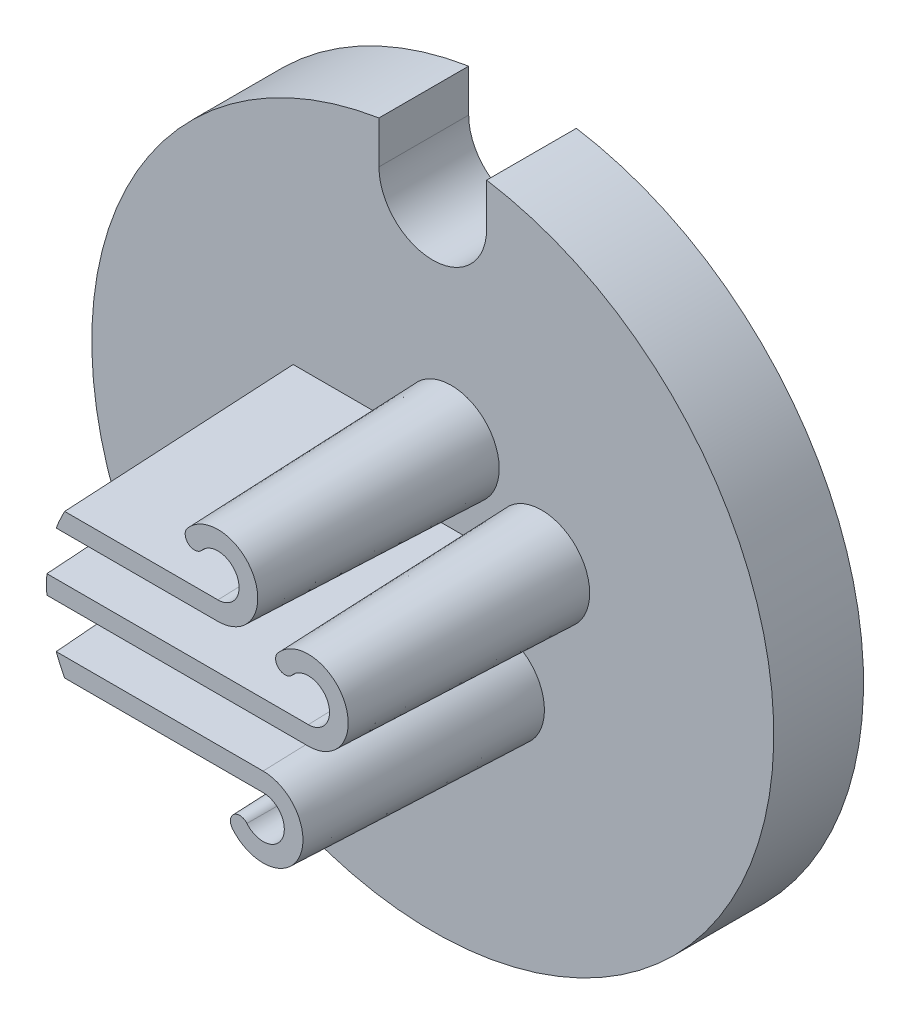
ISO-10303-21;
HEADER;
FILE_DESCRIPTION(('STEP AP214'),'2;1');
FILE_NAME('part.step','',(''),(''),'','','');
FILE_SCHEMA(('AUTOMOTIVE_DESIGN { 1 0 10303 214 1 1 1 1 }'));
ENDSEC;
DATA;
#1=APPLICATION_CONTEXT('core data for automotive mechanical design processes');
#2=APPLICATION_PROTOCOL_DEFINITION('international standard','automotive_design',2000,#1);
#3=PRODUCT_CONTEXT('',#1,'mechanical');
#4=PRODUCT('Part','Part','',(#3));
#5=PRODUCT_RELATED_PRODUCT_CATEGORY('part','',(#4));
#6=PRODUCT_DEFINITION_FORMATION('','',#4);
#7=PRODUCT_DEFINITION_CONTEXT('part definition',#1,'design');
#8=PRODUCT_DEFINITION('design','',#6,#7);
#9=PRODUCT_DEFINITION_SHAPE('','',#8);
#10=(LENGTH_UNIT() NAMED_UNIT(*) SI_UNIT(.MILLI.,.METRE.));
#11=(NAMED_UNIT(*) PLANE_ANGLE_UNIT() SI_UNIT($,.RADIAN.));
#12=(NAMED_UNIT(*) SI_UNIT($,.STERADIAN.) SOLID_ANGLE_UNIT());
#13=UNCERTAINTY_MEASURE_WITH_UNIT(LENGTH_MEASURE(1.E-05),#10,'distance_accuracy_value','');
#14=(GEOMETRIC_REPRESENTATION_CONTEXT(3) GLOBAL_UNCERTAINTY_ASSIGNED_CONTEXT((#13)) GLOBAL_UNIT_ASSIGNED_CONTEXT((#10,
#11,#12)) REPRESENTATION_CONTEXT('',''));
#15=CARTESIAN_POINT('',(0.,0.,0.));
#16=DIRECTION('',(0.,0.,1.));
#17=DIRECTION('',(1.,0.,0.));
#18=AXIS2_PLACEMENT_3D('',#15,#16,#17);
#19=CARTESIAN_POINT('',(2.38201240094966,1.39636946820992,2.50000000005457));
#20=DIRECTION('',(0.,0.,-1.));
#21=DIRECTION('',(-1.,0.,0.));
#22=AXIS2_PLACEMENT_3D('',#19,#20,#21);
#23=CONICAL_SURFACE('',#22,0.486985001693798,0.0349065850400188);
#24=CARTESIAN_POINT('',(2.38201240094966,1.39636946820992,2.49999999999773));
#25=DIRECTION('',(0.,0.,1.));
#26=DIRECTION('',(-0.766044443144308,0.642787609656352,0.));
#27=AXIS2_PLACEMENT_3D('',#24,#25,#26);
#28=CIRCLE('',#27,0.486985001695784);
#29=CARTESIAN_POINT('',(2.00896024650558,1.70939739339035,2.50000000001));
#30=VERTEX_POINT('',#29);
#31=CARTESIAN_POINT('',(2.75506455539278,1.08334154302959,2.4999999999759));
#32=VERTEX_POINT('',#31);
#33=EDGE_CURVE('E126',#30,#32,#28,.T.);
#34=ORIENTED_EDGE('',*,*,#33,.T.);
#35=DIRECTION('',(0.0267345655174141,-0.0224329640636936,-0.999390827019096));
#36=VECTOR('',#35,1.);
#37=CARTESIAN_POINT('',(-13345.857906575,11201.8995615213,499000.));
#38=LINE('',#37,#36);
#39=CARTESIAN_POINT('',(2.58118395616668,1.22924468969873,8.99999999997462));
#40=VERTEX_POINT('',#39);
#41=EDGE_CURVE('E129',#32,#40,#38,.F.);
#42=ORIENTED_EDGE('',*,*,#41,.T.);
#43=CARTESIAN_POINT('',(2.18284084573267,1.56349424672119,9.));
#44=CARTESIAN_POINT('',(2.11381867301379,1.48123682440876,9.));
#45=CARTESIAN_POINT('',(2.12300177944663,1.37370897508613,9.));
#46=CARTESIAN_POINT('',(2.12753896614898,1.32058164484691,9.));
#47=CARTESIAN_POINT('',(2.15330774130164,1.27269983307144,9.));
#48=CARTESIAN_POINT('',(2.17656184434811,1.22949061654943,9.));
#49=CARTESIAN_POINT('',(2.21488762243839,1.19719791299292,9.));
#50=CARTESIAN_POINT('',(2.25241304942153,1.16557957281093,9.));
#51=CARTESIAN_POINT('',(2.29993573284282,1.14966433945805,9.));
#52=CARTESIAN_POINT('',(2.35049552778685,1.13273198469864,9.));
#53=CARTESIAN_POINT('',(2.40467289407345,1.13735884670689,9.));
#54=CARTESIAN_POINT('',(2.45780022431265,1.14189603340923,9.));
#55=CARTESIAN_POINT('',(2.50568203608814,1.1676648085619,9.));
#56=CARTESIAN_POINT('',(2.54913478459891,1.1910499743403,9.));
#57=CARTESIAN_POINT('',(2.58118395616666,1.22924468969865,9.));
#58=B_SPLINE_CURVE_WITH_KNOTS('',2,(#43,#44,#45,#46,#47,#48,#49,#50,#51,#52,#53,#54,#55,#56,
#57),.UNSPECIFIED.,.F.,.F.,(3,2,2,2,2,2,2,3),(0.,0.25,0.375,0.5,0.625,0.75,0.875,1.),.UNSPECIFIED.);
#59=CARTESIAN_POINT('',(2.18284084573224,1.56349424672145,9.00000000000873));
#60=VERTEX_POINT('',#59);
#61=EDGE_CURVE('E137',#60,#40,#58,.T.);
#62=ORIENTED_EDGE('',*,*,#61,.F.);
#63=DIRECTION('',(0.0267345655174141,-0.0224329640636937,0.999390827019096));
#64=VECTOR('',#63,1.);
#65=CARTESIAN_POINT('',(-13346.737765191,11202.6378505614,-499000.));
#66=LINE('',#65,#64);
#67=EDGE_CURVE('E131',#30,#60,#66,.T.);
#68=ORIENTED_EDGE('',*,*,#67,.F.);
#69=EDGE_LOOP('',(#34,#42,#62,#68));
#70=FACE_BOUND('',#69,.T.);
#71=ADVANCED_FACE('F16',(#70),#23,.T.);
#72=CARTESIAN_POINT('',(0.,-0.059584240176571,9.));
#73=DIRECTION('',(0.,0.,1.));
#74=DIRECTION('',(1.,0.,0.));
#75=AXIS2_PLACEMENT_3D('',#72,#73,#74);
#76=PLANE('',#75);
#77=CARTESIAN_POINT('',(2.58118395616666,1.22924468969865,9.));
#78=CARTESIAN_POINT('',(2.67697081632274,1.34339902442139,9.));
#79=CARTESIAN_POINT('',(2.81596355358364,1.39857084350102,9.));
#80=CARTESIAN_POINT('',(2.96063041068655,1.45599494942331,9.));
#81=CARTESIAN_POINT('',(3.11578763152388,1.43418409017397,9.));
#82=CARTESIAN_POINT('',(3.25945756823654,1.41398802871391,9.));
#83=CARTESIAN_POINT('',(3.37808877295752,1.32866205766387,9.));
#84=CARTESIAN_POINT('',(3.50252083469823,1.23916379687526,9.));
#85=CARTESIAN_POINT('',(3.56787177196772,1.09934477443672,9.));
#86=CARTESIAN_POINT('',(3.63277254879005,0.960488875042656,9.));
#87=CARTESIAN_POINT('',(3.62154884221274,0.806560254303054,9.));
#88=CARTESIAN_POINT('',(3.61099805575308,0.661860462281041,9.));
#89=CARTESIAN_POINT('',(3.53377948513329,0.53779766743443,9.));
#90=CARTESIAN_POINT('',(3.45153285883404,0.405656574385303,9.));
#91=CARTESIAN_POINT('',(3.31377495303989,0.33101085230914,9.));
#92=CARTESIAN_POINT('',(3.1827251616964,0.26,9.));
#93=CARTESIAN_POINT('',(3.03315017762062,0.26,9.));
#94=B_SPLINE_CURVE_WITH_KNOTS('',2,(#77,#78,#79,#80,#81,#82,#83,#84,#85,#86,#87,#88,#89,#90,#91,
#92,#93),.UNSPECIFIED.,.F.,.F.,(3,2,2,2,2,2,2,2,3),(0.,0.125,0.25,0.375,0.5,0.625,0.75,0.875,
1.),.UNSPECIFIED.);
#95=CARTESIAN_POINT('',(3.03315017762062,0.259999999999376,9.00000000000364));
#96=VERTEX_POINT('',#95);
#97=EDGE_CURVE('E148',#40,#96,#94,.T.);
#98=ORIENTED_EDGE('',*,*,#97,.T.);
#99=DIRECTION('',(1.,0.,0.));
#100=VECTOR('',#99,1.);
#101=CARTESIAN_POINT('',(0.,0.26,9.));
#102=LINE('',#101,#100);
#103=CARTESIAN_POINT('',(-4.25205832509357,0.259999999999983,9.00000000000291));
#104=VERTEX_POINT('',#103);
#105=EDGE_CURVE('E715',#104,#96,#102,.T.);
#106=ORIENTED_EDGE('',*,*,#105,.F.);
#107=CARTESIAN_POINT('',(-2.22044604925031E-13,0.,9.00000000001455));
#108=DIRECTION('',(0.,0.,-1.));
#109=DIRECTION('',(-0.998135757064285,-0.0610328638497867,0.));
#110=AXIS2_PLACEMENT_3D('',#107,#108,#109);
#111=CIRCLE('',#110,4.25999999999882);
#112=CARTESIAN_POINT('',(-4.25205832509357,-0.259999999999984,9.00000000000291));
#113=VERTEX_POINT('',#112);
#114=EDGE_CURVE('E488',#113,#104,#111,.T.);
#115=ORIENTED_EDGE('',*,*,#114,.F.);
#116=DIRECTION('',(1.,0.,0.));
#117=VECTOR('',#116,1.);
#118=CARTESIAN_POINT('',(0.,-0.26,9.));
#119=LINE('',#118,#117);
#120=CARTESIAN_POINT('',(3.03315017762062,-0.260000000000431,9.00000000000364));
#121=VERTEX_POINT('',#120);
#122=EDGE_CURVE('E537',#121,#113,#119,.F.);
#123=ORIENTED_EDGE('',*,*,#122,.F.);
#124=CARTESIAN_POINT('',(3.03315017762062,0.85,9.00000000001455));
#125=DIRECTION('',(0.,0.,-1.));
#126=DIRECTION('',(-0.766044443142215,0.642787609658847,0.));
#127=AXIS2_PLACEMENT_3D('',#124,#125,#126);
#128=CIRCLE('',#127,1.11000000000173);
#129=EDGE_CURVE('E534',#60,#121,#128,.T.);
#130=ORIENTED_EDGE('',*,*,#129,.F.);
#131=ORIENTED_EDGE('',*,*,#61,.T.);
#132=EDGE_LOOP('',(#98,#106,#115,#123,#130,#131));
#133=FACE_BOUND('',#132,.T.);
#134=ADVANCED_FACE('F508',(#133),#76,.T.);
#135=CARTESIAN_POINT('',(3.03315017762062,0.85,8.99999999984402));
#136=DIRECTION('',(0.,0.,1.));
#137=DIRECTION('',(1.,0.,0.));
#138=AXIS2_PLACEMENT_3D('',#135,#136,#137);
#139=CONICAL_SURFACE('',#138,0.589999999996543,0.0349065850400188);
#140=ORIENTED_EDGE('',*,*,#41,.F.);
#141=CARTESIAN_POINT('',(3.03315017762062,0.48698500169636,2.5));
#142=CARTESIAN_POINT('',(3.12473025880445,0.48698500169636,2.5));
#143=CARTESIAN_POINT('',(3.2058128935067,0.530676534629483,2.5));
#144=CARTESIAN_POINT('',(3.28994350684749,0.57601047668701,2.5));
#145=CARTESIAN_POINT('',(3.34117720680276,0.657908255547995,2.5));
#146=CARTESIAN_POINT('',(3.38841286629723,0.733415111367655,2.5));
#147=CARTESIAN_POINT('',(3.39517990682193,0.823272408117817,2.5));
#148=CARTESIAN_POINT('',(3.40224665970291,0.917109486286406,2.5));
#149=CARTESIAN_POINT('',(3.36215349739152,1.00341676757486,2.5));
#150=CARTESIAN_POINT('',(3.32250823367315,1.08875987174115,2.5));
#151=CARTESIAN_POINT('',(3.24538387863941,1.14451102720486,2.5));
#152=CARTESIAN_POINT('',(3.17320224197974,1.19668922234538,2.5));
#153=CARTESIAN_POINT('',(3.08399532200792,1.2094365872941,2.5));
#154=CARTESIAN_POINT('',(2.98938975383603,1.22295540067818,2.5));
#155=CARTESIAN_POINT('',(2.89951966583019,1.18752448105585,2.5));
#156=CARTESIAN_POINT('',(2.81428918462994,1.15392270769849,2.5));
#157=CARTESIAN_POINT('',(2.7550645553928,1.08334154302987,2.5));
#158=B_SPLINE_CURVE_WITH_KNOTS('',2,(#141,#142,#143,#144,#145,#146,#147,#148,#149,#150,#151,
#152,#153,#154,#155,#156,#157),.UNSPECIFIED.,.F.,.F.,(3,2,2,2,2,2,2,2,3),(0.,0.125,0.25,0.375,
0.5,0.625,0.75,0.875,1.),.UNSPECIFIED.);
#159=CARTESIAN_POINT('',(3.03315017762062,0.486985001696098,2.49999999999943));
#160=VERTEX_POINT('',#159);
#161=EDGE_CURVE('E144',#160,#32,#158,.T.);
#162=ORIENTED_EDGE('',*,*,#161,.F.);
#163=DIRECTION('',(0.,-0.0348994967025009,0.999390827019096));
#164=VECTOR('',#163,1.);
#165=CARTESIAN_POINT('',(3.03315017762062,0.26,9.));
#166=LINE('',#165,#164);
#167=EDGE_CURVE('E1127',#96,#160,#166,.F.);
#168=ORIENTED_EDGE('',*,*,#167,.F.);
#169=ORIENTED_EDGE('',*,*,#97,.F.);
#170=EDGE_LOOP('',(#140,#162,#168,#169));
#171=FACE_BOUND('',#170,.T.);
#172=ADVANCED_FACE('F142',(#171),#139,.F.);
#173=CARTESIAN_POINT('',(-2.22044604925031E-13,0.,2.50000000005457));
#174=DIRECTION('',(0.,0.,-1.));
#175=DIRECTION('',(-1.,0.,0.));
#176=AXIS2_PLACEMENT_3D('',#173,#174,#175);
#177=CONICAL_SURFACE('',#176,4.48698500169464,0.0349065850400188);
#178=CARTESIAN_POINT('',(-2.22044604925031E-13,0.,2.49999999999773));
#179=DIRECTION('',(0.,0.,1.));
#180=DIRECTION('',(-0.994092869634086,0.108532790172682,0.));
#181=AXIS2_PLACEMENT_3D('',#178,#179,#180);
#182=CIRCLE('',#181,4.48698500169663);
#183=CARTESIAN_POINT('',(-4.46047979634215,0.486985001696865,2.49999999999953));
#184=VERTEX_POINT('',#183);
#185=CARTESIAN_POINT('',(-4.46047979634213,-0.486985001696867,2.49999999999953));
#186=VERTEX_POINT('',#185);
#187=EDGE_CURVE('E476',#184,#186,#182,.T.);
#188=ORIENTED_EDGE('',*,*,#187,.T.);
#189=CARTESIAN_POINT('',(-4.25205832509384,-0.26,9.));
#190=CARTESIAN_POINT('',(-4.35626906070877,-0.370777531483909,5.82774655037062));
#191=CARTESIAN_POINT('',(-4.46047979634227,-0.486985001696361,2.49999999999997));
#192=B_SPLINE_CURVE_WITH_KNOTS('',2,(#189,#190,#191),.UNSPECIFIED.,.F.,.F.,(3,3),(0.,1.),.UNSPECIFIED.);
#193=EDGE_CURVE('E573',#113,#186,#192,.T.);
#194=ORIENTED_EDGE('',*,*,#193,.F.);
#195=ORIENTED_EDGE('',*,*,#114,.T.);
#196=CARTESIAN_POINT('',(-4.46047979634229,0.486985001696361,2.49999999999997));
#197=CARTESIAN_POINT('',(-4.3562690607086,0.370777531483712,5.82774655037627));
#198=CARTESIAN_POINT('',(-4.25205832509384,0.26,9.));
#199=B_SPLINE_CURVE_WITH_KNOTS('',2,(#196,#197,#198),.UNSPECIFIED.,.F.,.F.,(3,3),(0.,1.),.UNSPECIFIED.);
#200=EDGE_CURVE('E711',#184,#104,#199,.T.);
#201=ORIENTED_EDGE('',*,*,#200,.F.);
#202=EDGE_LOOP('',(#188,#194,#195,#201));
#203=FACE_BOUND('',#202,.T.);
#204=ADVANCED_FACE('F423',(#203),#177,.T.);
#205=CARTESIAN_POINT('',(0.51315017762061,2.59999999999988,8.99999999978718));
#206=DIRECTION('',(0.,0.,1.));
#207=DIRECTION('',(1.,0.,0.));
#208=AXIS2_PLACEMENT_3D('',#205,#206,#207);
#209=CONICAL_SURFACE('',#208,0.589999999992478,0.034906585039923);
#210=CARTESIAN_POINT('',(0.235088754926668,2.83332124794786,2.50000082712633));
#211=CARTESIAN_POINT('',(0.2278422268159,2.83940168960281,2.7708341060612));
#212=CARTESIAN_POINT('',(0.220595705951798,2.84548213989399,3.04166738499609));
#213=CARTESIAN_POINT('',(0.206102678716961,2.85764305774878,3.58333394286584));
#214=CARTESIAN_POINT('',(0.198856172346225,2.8637235253124,3.85416722180072));
#215=CARTESIAN_POINT('',(0.18436317409815,2.87588447771203,4.39583377967048));
#216=CARTESIAN_POINT('',(0.177116682220811,2.88196496254805,4.66666705860536));
#217=CARTESIAN_POINT('',(0.162623712959559,2.89412594949246,5.20833361647512));
#218=CARTESIAN_POINT('',(0.155377235575647,2.90020645160086,5.47916689541));
#219=CARTESIAN_POINT('',(0.140884295301281,2.91236747309002,6.02083345327976));
#220=CARTESIAN_POINT('',(0.133637832410828,2.91844799247077,6.29166673221464));
#221=CARTESIAN_POINT('',(0.119144921123409,2.93060904850461,6.8333332900844));
#222=CARTESIAN_POINT('',(0.111898472726444,2.93668958515769,7.10416656901928));
#223=CARTESIAN_POINT('',(0.097405590426035,2.94885067573616,7.64583312688904));
#224=CARTESIAN_POINT('',(0.0901591565225902,2.95493122966155,7.91666640582392));
#225=CARTESIAN_POINT('',(0.0756663032092515,2.96709235478459,8.45833296369368));
#226=CARTESIAN_POINT('',(0.0684198837993576,2.97317292598226,8.72916624262856));
#227=CARTESIAN_POINT('',(0.0611734716362545,2.97925350581605,8.99999952156345));
#228=B_SPLINE_CURVE_WITH_KNOTS('',3,(#210,#211,#212,#213,#214,#215,#216,#217,#218,#219,#220,
#221,#222,#223,#224,#225,#226,#227),.UNSPECIFIED.,.F.,.F.,(4,2,2,2,2,2,2,2,4),(0.,
0.812995289205885,1.62599057841175,2.43898586761759,3.25198115682341,4.06497644602921,
4.877971735235,5.69096702444077,6.50396231364652),.UNSPECIFIED.);
#229=CARTESIAN_POINT('',(0.235076659767047,2.83333139714779,2.50000047160848));
#230=VERTEX_POINT('',#229);
#231=CARTESIAN_POINT('',(0.0611787162847192,2.97924910487298,8.99999976341618));
#232=VERTEX_POINT('',#231);
#233=EDGE_CURVE('E443',#230,#232,#228,.T.);
#234=ORIENTED_EDGE('',*,*,#233,.F.);
#235=CARTESIAN_POINT('',(0.513150177620611,2.23698500169636,2.5));
#236=CARTESIAN_POINT('',(0.604730258267178,2.23698500169636,2.5));
#237=CARTESIAN_POINT('',(0.68581289261778,2.28067653414877,2.5));
#238=CARTESIAN_POINT('',(0.769943505542546,2.32601047567994,2.5));
#239=CARTESIAN_POINT('',(0.821177205659085,2.40790825371396,2.5));
#240=CARTESIAN_POINT('',(0.868412865339471,2.48341510883072,2.5));
#241=CARTESIAN_POINT('',(0.875179906593846,2.57327240502845,2.5));
#242=CARTESIAN_POINT('',(0.882246660231517,2.66710948254973,2.5));
#243=CARTESIAN_POINT('',(0.842153499166292,2.75341676376871,2.5));
#244=CARTESIAN_POINT('',(0.802508236683245,2.83875986785966,2.5));
#245=CARTESIAN_POINT('',(0.725383882940317,2.89451102410536,2.5));
#246=CARTESIAN_POINT('',(0.653201745408832,2.94668958291806,2.5));
#247=CARTESIAN_POINT('',(0.563996151004999,2.95943589599156,2.5));
#248=CARTESIAN_POINT('',(0.469391899828661,2.97295360653019,2.5));
#249=CARTESIAN_POINT('',(0.379524930952516,2.93752007157741,2.5));
#250=CARTESIAN_POINT('',(0.294297407812164,2.9039158178911,2.5));
#251=CARTESIAN_POINT('',(0.235076661602182,2.83333139567753,2.5));
#252=B_SPLINE_CURVE_WITH_KNOTS('',2,(#235,#236,#237,#238,#239,#240,#241,#242,#243,#244,#245,
#246,#247,#248,#249,#250,#251),.UNSPECIFIED.,.F.,.F.,(3,2,2,2,2,2,2,2,3),(0.,0.125,0.25,0.375,
0.5,0.625,0.75,0.875,1.),.UNSPECIFIED.);
#253=CARTESIAN_POINT('',(0.513150177620611,2.23698500169643,2.49999999999943));
#254=VERTEX_POINT('',#253);
#255=EDGE_CURVE('E462',#254,#230,#252,.T.);
#256=ORIENTED_EDGE('',*,*,#255,.F.);
#257=DIRECTION('',(0.,-0.0348994967025009,0.999390827019096));
#258=VECTOR('',#257,1.);
#259=CARTESIAN_POINT('',(0.513150177620611,2.01,9.));
#260=LINE('',#259,#258);
#261=CARTESIAN_POINT('',(0.513150177620611,2.01000000000036,8.99999999998943));
#262=VERTEX_POINT('',#261);
#263=EDGE_CURVE('E703',#262,#254,#260,.F.);
#264=ORIENTED_EDGE('',*,*,#263,.F.);
#265=CARTESIAN_POINT('',(0.0611787183787752,2.97924910309323,9.));
#266=CARTESIAN_POINT('',(0.15696725667547,3.09340202851268,9.));
#267=CARTESIAN_POINT('',(0.295961285148526,3.14857276115783,9.));
#268=CARTESIAN_POINT('',(0.440629486086433,3.20599573625885,9.));
#269=CARTESIAN_POINT('',(0.595787285101314,3.18418438807556,9.));
#270=CARTESIAN_POINT('',(0.739457794564514,3.16398786862588,9.));
#271=CARTESIAN_POINT('',(0.858088780163022,3.07866205247123,9.));
#272=CARTESIAN_POINT('',(0.982520839755821,2.98916379038571,9.));
#273=CARTESIAN_POINT('',(1.04787177494108,2.84934476806019,9.));
#274=CARTESIAN_POINT('',(1.11277254968997,2.71048886878599,9.));
#275=CARTESIAN_POINT('',(1.10154884183063,2.55656024912738,9.));
#276=CARTESIAN_POINT('',(1.09099805415907,2.41186045802914,9.));
#277=CARTESIAN_POINT('',(1.01377948321724,2.28779766436187,9.));
#278=CARTESIAN_POINT('',(0.931532856652774,2.15565657269387,9.));
#279=CARTESIAN_POINT('',(0.793774951550655,2.08101085150383,9.));
#280=CARTESIAN_POINT('',(0.662725160796,2.01,9.));
#281=CARTESIAN_POINT('',(0.513150177620611,2.01,9.));
#282=B_SPLINE_CURVE_WITH_KNOTS('',2,(#265,#266,#267,#268,#269,#270,#271,#272,#273,#274,#275,
#276,#277,#278,#279,#280,#281),.UNSPECIFIED.,.F.,.F.,(3,2,2,2,2,2,2,2,3),(0.,0.125,0.25,0.375,
0.5,0.625,0.75,0.875,1.),.UNSPECIFIED.);
#283=EDGE_CURVE('E406',#232,#262,#282,.T.);
#284=ORIENTED_EDGE('',*,*,#283,.F.);
#285=EDGE_LOOP('',(#234,#256,#264,#284));
#286=FACE_BOUND('',#285,.T.);
#287=ADVANCED_FACE('F413',(#286),#209,.F.);
#288=CARTESIAN_POINT('',(-0.137984169460023,3.14637355929855,2.50000082735369));
#289=DIRECTION('',(0.,0.,-1.));
#290=DIRECTION('',(-1.,0.,0.));
#291=AXIS2_PLACEMENT_3D('',#288,#289,#290);
#292=CONICAL_SURFACE('',#291,0.48701658754575,0.0349135499951622);
#293=CARTESIAN_POINT('',(-0.137984169460023,3.14637355929855,2.50000135298478));
#294=DIRECTION('',(0.,0.,1.));
#295=DIRECTION('',(-0.766045947566524,0.64278581675151,0.));
#296=AXIS2_PLACEMENT_3D('',#293,#294,#295);
#297=CIRCLE('',#296,0.487016569186642);
#298=CARTESIAN_POINT('',(-0.511049152580732,3.45941076101538,2.5000007280887));
#299=VERTEX_POINT('',#298);
#300=EDGE_CURVE('E81',#299,#230,#297,.T.);
#301=ORIENTED_EDGE('',*,*,#300,.T.);
#302=ORIENTED_EDGE('',*,*,#233,.T.);
#303=CARTESIAN_POINT('',(-0.337153914314522,3.31348983976598,9.));
#304=CARTESIAN_POINT('',(-0.406167578092475,3.23123472401727,9.));
#305=CARTESIAN_POINT('',(-0.396982449875354,3.12371288055808,9.));
#306=CARTESIAN_POINT('',(-0.392444268310145,3.07058856521817,9.));
#307=CARTESIAN_POINT('',(-0.366676588604586,3.02270970959904,9.));
#308=CARTESIAN_POINT('',(-0.343423455746508,2.97950312664217,9.));
#309=CARTESIAN_POINT('',(-0.305100136014632,2.94721248879156,9.));
#310=CARTESIAN_POINT('',(-0.267577178375805,2.91559622369042,9.));
#311=CARTESIAN_POINT('',(-0.220057244727367,2.89968148272082,9.));
#312=CARTESIAN_POINT('',(-0.169500567008274,2.88274971601982,9.));
#313=CARTESIAN_POINT('',(-0.115325979848481,2.88737506059618,9.));
#314=CARTESIAN_POINT('',(-0.0622014516497128,2.89191075272155,9.));
#315=CARTESIAN_POINT('',(-0.0143213883228831,2.91767618866848,9.));
#316=CARTESIAN_POINT('',(0.0291298261696109,2.941058352476,9.));
#317=CARTESIAN_POINT('',(0.0611787183787752,2.97924910309323,9.));
#318=B_SPLINE_CURVE_WITH_KNOTS('',2,(#303,#304,#305,#306,#307,#308,#309,#310,#311,#312,#313,
#314,#315,#316,#317),.UNSPECIFIED.,.F.,.F.,(3,2,2,2,2,2,2,3),(0.,0.25,0.375,0.5,0.625,0.75,
0.875,1.),.UNSPECIFIED.);
#319=CARTESIAN_POINT('',(-0.33715391213318,3.31348983809459,8.99999976340223));
#320=VERTEX_POINT('',#319);
#321=EDGE_CURVE('E753',#320,#232,#318,.T.);
#322=ORIENTED_EDGE('',*,*,#321,.F.);
#323=CARTESIAN_POINT('',(-0.511037047996394,3.45940060408184,2.50000025010879));
#324=CARTESIAN_POINT('',(-0.503792155099076,3.45332114947577,2.77083357301679));
#325=CARTESIAN_POINT('',(-0.496547259810034,3.44724169771999,3.04166689592479));
#326=CARTESIAN_POINT('',(-0.482057464448504,3.43508279990896,3.5833335417408));
#327=CARTESIAN_POINT('',(-0.474812564376016,3.42900335385373,3.8541668646488));
#328=CARTESIAN_POINT('',(-0.460322759447598,3.41684446744381,4.39583351046481));
#329=CARTESIAN_POINT('',(-0.453077854591667,3.41076502708913,4.66666683337281));
#330=CARTESIAN_POINT('',(-0.438588040096368,3.39860615208033,5.20833347918882));
#331=CARTESIAN_POINT('',(-0.431343130456998,3.39252671742621,5.47916680209682));
#332=CARTESIAN_POINT('',(-0.416853306394824,3.38036785381852,6.02083344791283));
#333=CARTESIAN_POINT('',(-0.40960839197202,3.37428842486496,6.29166677082083));
#334=CARTESIAN_POINT('',(-0.395118558342978,3.36212957265839,6.83333341663684));
#335=CARTESIAN_POINT('',(-0.387873639136741,3.35605014940539,7.10416673954484));
#336=CARTESIAN_POINT('',(-0.373383795940838,3.34389130859996,7.64583338536085));
#337=CARTESIAN_POINT('',(-0.366138871951172,3.33781189104753,7.91666670826885));
#338=CARTESIAN_POINT('',(-0.351649019188415,3.32565306164322,8.45833335408486));
#339=CARTESIAN_POINT('',(-0.344404090415324,3.31957364979136,8.72916667699286));
#340=CARTESIAN_POINT('',(-0.337159159250521,3.31349424078978,8.99999999990087));
#341=B_SPLINE_CURVE_WITH_KNOTS('',3,(#323,#324,#325,#326,#327,#328,#329,#330,#331,#332,#333,
#334,#335,#336,#337,#338,#339,#340),.UNSPECIFIED.,.F.,.F.,(4,2,2,2,2,2,2,2,4),(0.,
0.812995223447911,1.62599044689581,2.43898567034371,3.2519808937916,4.06497611723948,
4.87797134068736,5.69096656413523,6.5039617875831),.UNSPECIFIED.);
#342=EDGE_CURVE('E774',#299,#320,#341,.T.);
#343=ORIENTED_EDGE('',*,*,#342,.F.);
#344=EDGE_LOOP('',(#301,#302,#322,#343));
#345=FACE_BOUND('',#344,.T.);
#346=ADVANCED_FACE('F422',(#345),#292,.T.);
#347=CARTESIAN_POINT('',(0.,-0.059584240176571,9.));
#348=DIRECTION('',(0.,0.,1.));
#349=DIRECTION('',(1.,0.,0.));
#350=AXIS2_PLACEMENT_3D('',#347,#348,#349);
#351=PLANE('',#350);
#352=ORIENTED_EDGE('',*,*,#321,.T.);
#353=ORIENTED_EDGE('',*,*,#283,.T.);
#354=DIRECTION('',(1.,0.,0.));
#355=VECTOR('',#354,1.);
#356=CARTESIAN_POINT('',(0.,2.01,9.));
#357=LINE('',#356,#355);
#358=CARTESIAN_POINT('',(-3.75599520766439,2.00999999999989,9.00000000000291));
#359=VERTEX_POINT('',#358);
#360=EDGE_CURVE('E706',#359,#262,#357,.T.);
#361=ORIENTED_EDGE('',*,*,#360,.F.);
#362=CARTESIAN_POINT('',(-2.62376925741492E-13,1.15250690935209E-13,9.00000000001455));
#363=DIRECTION('',(0.,0.,-1.));
#364=DIRECTION('',(-0.93683737337124,0.349765258215958,0.));
#365=AXIS2_PLACEMENT_3D('',#362,#363,#364);
#366=CIRCLE('',#365,4.25999999999886);
#367=CARTESIAN_POINT('',(-3.99092721056125,1.48999999999992,9.00000000000291));
#368=VERTEX_POINT('',#367);
#369=EDGE_CURVE('E390',#368,#359,#366,.T.);
#370=ORIENTED_EDGE('',*,*,#369,.F.);
#371=DIRECTION('',(1.,0.,0.));
#372=VECTOR('',#371,1.);
#373=CARTESIAN_POINT('',(0.,1.49,9.));
#374=LINE('',#373,#372);
#375=CARTESIAN_POINT('',(0.51315017762061,1.48999999999875,8.99999999997521));
#376=VERTEX_POINT('',#375);
#377=EDGE_CURVE('E696',#376,#368,#374,.F.);
#378=ORIENTED_EDGE('',*,*,#377,.F.);
#379=CARTESIAN_POINT('',(0.513150177620611,2.59999999999988,8.99999999990087));
#380=DIRECTION('',(0.,0.,-1.));
#381=DIRECTION('',(-0.766044447628362,0.642787604312465,0.));
#382=AXIS2_PLACEMENT_3D('',#379,#380,#381);
#383=CIRCLE('',#382,1.11000000000477);
#384=EDGE_CURVE('E776',#320,#376,#383,.T.);
#385=ORIENTED_EDGE('',*,*,#384,.F.);
#386=EDGE_LOOP('',(#352,#353,#361,#370,#378,#385));
#387=FACE_BOUND('',#386,.T.);
#388=ADVANCED_FACE('F364',(#387),#351,.T.);
#389=CARTESIAN_POINT('',(-2.62376925741492E-13,1.15250690935209E-13,2.50000000005457));
#390=DIRECTION('',(0.,0.,-1.));
#391=DIRECTION('',(-1.,0.,0.));
#392=AXIS2_PLACEMENT_3D('',#389,#390,#391);
#393=CONICAL_SURFACE('',#392,4.48698500169468,0.0349065850400188);
#394=CARTESIAN_POINT('',(-2.62376925741492E-13,1.15250690935209E-13,2.49999999999773));
#395=DIRECTION('',(0.,0.,1.));
#396=DIRECTION('',(-0.866861120446538,0.498549694472049,0.));
#397=AXIS2_PLACEMENT_3D('',#394,#395,#396);
#398=CIRCLE('',#397,4.48698500169667);
#399=CARTESIAN_POINT('',(-3.88959284599752,2.23698500169647,2.49999999999955));
#400=VERTEX_POINT('',#399);
#401=CARTESIAN_POINT('',(-4.30555774778576,1.26301499830295,2.49999999999953));
#402=VERTEX_POINT('',#401);
#403=EDGE_CURVE('E240',#400,#402,#398,.T.);
#404=ORIENTED_EDGE('',*,*,#403,.T.);
#405=CARTESIAN_POINT('',(-3.99092721056148,1.49,9.));
#406=CARTESIAN_POINT('',(-4.14824247916245,1.38081151546149,5.87325090117757));
#407=CARTESIAN_POINT('',(-4.305557747786,1.26301499830364,2.49999999999996));
#408=B_SPLINE_CURVE_WITH_KNOTS('',2,(#405,#406,#407),.UNSPECIFIED.,.F.,.F.,(3,3),(0.,1.),.UNSPECIFIED.);
#409=EDGE_CURVE('E347',#368,#402,#408,.T.);
#410=ORIENTED_EDGE('',*,*,#409,.F.);
#411=ORIENTED_EDGE('',*,*,#369,.T.);
#412=CARTESIAN_POINT('',(-3.88959284599733,2.23698500169636,2.5));
#413=DIRECTION('',(0.0205366301291652,-0.0348921364395594,0.999180056665274));
#414=VECTOR('',#413,1.);
#415=LINE('',#412,#414);
#416=EDGE_CURVE('E705',#400,#359,#415,.T.);
#417=ORIENTED_EDGE('',*,*,#416,.F.);
#418=EDGE_LOOP('',(#404,#410,#411,#417));
#419=FACE_BOUND('',#418,.T.);
#420=ADVANCED_FACE('F354',(#419),#393,.T.);
#421=CARTESIAN_POINT('',(1.77315017762063,-2.59999999999988,8.99999999995771));
#422=DIRECTION('',(0.,0.,1.));
#423=DIRECTION('',(1.,0.,0.));
#424=AXIS2_PLACEMENT_3D('',#421,#422,#423);
#425=CONICAL_SURFACE('',#424,0.589999999998048,0.0349065850398489);
#426=DIRECTION('',(0.,-0.0348994967025009,-0.999390827019096));
#427=VECTOR('',#426,1.);
#428=CARTESIAN_POINT('',(1.77315017762063,-2.00999999999985,9.));
#429=LINE('',#428,#427);
#430=CARTESIAN_POINT('',(1.77315017762063,-2.23698499952264,2.50000006224298));
#431=VERTEX_POINT('',#430);
#432=CARTESIAN_POINT('',(1.77315017762063,-2.00999999999982,9.00000000000364));
#433=VERTEX_POINT('',#432);
#434=EDGE_CURVE('E243',#431,#433,#429,.F.);
#435=ORIENTED_EDGE('',*,*,#434,.F.);
#436=CARTESIAN_POINT('',(1.49507929820142,-2.83333453698321,2.5));
#437=CARTESIAN_POINT('',(1.55394260377735,-2.9034913209813,2.5));
#438=CARTESIAN_POINT('',(1.63952828561918,-2.93752139945979,2.5));
#439=CARTESIAN_POINT('',(1.72833119314285,-2.97283069240594,2.5));
#440=CARTESIAN_POINT('',(1.82399916693554,-2.95943546932193,2.5));
#441=CARTESIAN_POINT('',(1.91220160243658,-2.9470855547868,2.5));
#442=CARTESIAN_POINT('',(1.98538598313018,-2.89450951063276,2.5));
#443=CARTESIAN_POINT('',(2.06181115013453,-2.8396052685415,2.5));
#444=CARTESIAN_POINT('',(2.10215436580999,-2.75341490523196,2.5));
#445=CARTESIAN_POINT('',(2.14204688760535,-2.66818741681022,2.5));
#446=CARTESIAN_POINT('',(2.13517979522123,-2.57327089650819,2.5));
#447=CARTESIAN_POINT('',(2.1287527967974,-2.48443732732721,2.5));
#448=CARTESIAN_POINT('',(2.08117664718946,-2.40790735818749,2.5));
#449=CARTESIAN_POINT('',(2.03072129502027,-2.32674596584567,2.5));
#450=CARTESIAN_POINT('',(1.9458124585528,-2.28067629944384,2.5));
#451=CARTESIAN_POINT('',(1.86528708154751,-2.23698500169609,2.5));
#452=CARTESIAN_POINT('',(1.77315017762063,-2.23698500169609,2.5));
#453=B_SPLINE_CURVE_WITH_KNOTS('',2,(#436,#437,#438,#439,#440,#441,#442,#443,#444,#445,#446,
#447,#448,#449,#450,#451,#452),.UNSPECIFIED.,.F.,.F.,(3,2,2,2,2,2,2,2,3),(0.,0.125,0.25,0.375,
0.5,0.625,0.75,0.875,1.),.UNSPECIFIED.);
#454=CARTESIAN_POINT('',(1.49507930527671,-2.83333453117488,2.50000078803071));
#455=VERTEX_POINT('',#454);
#456=EDGE_CURVE('E231',#455,#431,#453,.T.);
#457=ORIENTED_EDGE('',*,*,#456,.F.);
#458=CARTESIAN_POINT('',(1.32117350614216,-2.97925348813328,8.99999952201829));
#459=CARTESIAN_POINT('',(1.32841997450264,-2.97317297646348,8.72916626497522));
#460=CARTESIAN_POINT('',(1.33566645671357,-2.96709248129967,8.45833300793216));
#461=CARTESIAN_POINT('',(1.35015944883625,-2.95493152398408,7.91666649384603));
#462=CARTESIAN_POINT('',(1.357405958748,-2.94885106183232,7.64583323680296));
#463=CARTESIAN_POINT('',(1.37189900627218,-2.93669017054093,7.10416672271683));
#464=CARTESIAN_POINT('',(1.37914554388461,-2.93060974140131,6.83333346567377));
#465=CARTESIAN_POINT('',(1.39363864681007,-2.91844891613431,6.29166695158763));
#466=CARTESIAN_POINT('',(1.40088521212309,-2.91236852000693,6.02083369454457));
#467=CARTESIAN_POINT('',(1.4153783704496,-2.90020776076451,5.47916718045844));
#468=CARTESIAN_POINT('',(1.42262496346309,-2.89412739764946,5.20833392341537));
#469=CARTESIAN_POINT('',(1.43711817719042,-2.8819667044318,4.66666740932924));
#470=CARTESIAN_POINT('',(1.44436479790426,-2.87588637432919,4.39583415228618));
#471=CARTESIAN_POINT('',(1.45885806703219,-2.86372574713648,3.85416763820005));
#472=CARTESIAN_POINT('',(1.46610471544628,-2.85764545004639,3.58333438115698));
#473=CARTESIAN_POINT('',(1.48059803997458,-2.84548488887883,3.04166786707085));
#474=CARTESIAN_POINT('',(1.4878447160888,-2.83940462480135,2.77083461002779));
#475=CARTESIAN_POINT('',(1.49509140605302,-2.83332437723024,2.50000135298474));
#476=B_SPLINE_CURVE_WITH_KNOTS('',3,(#458,#459,#460,#461,#462,#463,#464,#465,#466,#467,#468,
#469,#470,#471,#472,#473,#474,#475),.UNSPECIFIED.,.F.,.F.,(4,2,2,2,2,2,2,2,4),(0.,
0.812995223490166,1.62599044698038,2.43898567047066,3.251980893961,4.0649761174514,
4.87797134094188,5.69096656443244,6.50396178792308),.UNSPECIFIED.);
#477=CARTESIAN_POINT('',(1.32117873637581,-2.97924909939727,8.99999976312109));
#478=VERTEX_POINT('',#477);
#479=EDGE_CURVE('E865',#478,#455,#476,.T.);
#480=ORIENTED_EDGE('',*,*,#479,.F.);
#481=CARTESIAN_POINT('',(1.77315017762063,-2.00999999999973,9.));
#482=CARTESIAN_POINT('',(1.92216807681854,-2.00999999999973,9.));
#483=CARTESIAN_POINT('',(2.05377495063736,-2.08101085100976,9.));
#484=CARTESIAN_POINT('',(2.19075443003192,-2.15492058779228,9.));
#485=CARTESIAN_POINT('',(2.27377948204223,-2.28779766247736,9.));
#486=CARTESIAN_POINT('',(2.35065765709297,-2.41083699531151,9.));
#487=CARTESIAN_POINT('',(2.36154884159645,-2.55656024595305,9.));
#488=CARTESIAN_POINT('',(2.3729725858306,-2.70940910676932,9.));
#489=CARTESIAN_POINT('',(2.3078717767649,-2.84934476414941,9.));
#490=CARTESIAN_POINT('',(2.24321940518081,-2.98831649504862,9.));
#491=CARTESIAN_POINT('',(2.1180887845825,-3.07866204928663,9.));
#492=CARTESIAN_POINT('',(2.00046061829128,-3.16359075679856,9.));
#493=CARTESIAN_POINT('',(1.85578729243284,-3.1841843863513,9.));
#494=CARTESIAN_POINT('',(1.70169366113695,-3.20611895611746,9.));
#495=CARTESIAN_POINT('',(1.5559612985033,-3.14857275866975,9.));
#496=CARTESIAN_POINT('',(1.41732536598624,-3.09382877043132,9.));
#497=CARTESIAN_POINT('',(1.32117873841506,-2.97924909754697,9.));
#498=B_SPLINE_CURVE_WITH_KNOTS('',2,(#481,#482,#483,#484,#485,#486,#487,#488,#489,#490,#491,
#492,#493,#494,#495,#496,#497),.UNSPECIFIED.,.F.,.F.,(3,2,2,2,2,2,2,2,3),(0.,0.125,0.25,0.375,
0.5,0.625,0.75,0.875,1.),.UNSPECIFIED.);
#499=EDGE_CURVE('E247',#433,#478,#498,.T.);
#500=ORIENTED_EDGE('',*,*,#499,.F.);
#501=EDGE_LOOP('',(#435,#457,#480,#500));
#502=FACE_BOUND('',#501,.T.);
#503=ADVANCED_FACE('F244',(#502),#425,.F.);
#504=CARTESIAN_POINT('',(-1.17093834628434E-13,1.0549287138284E-13,2.50000000005457));
#505=DIRECTION('',(0.,0.,-1.));
#506=DIRECTION('',(-1.,0.,0.));
#507=AXIS2_PLACEMENT_3D('',#504,#505,#506);
#508=CONICAL_SURFACE('',#507,4.48698500169454,0.0349065850400188);
#509=CARTESIAN_POINT('',(-1.17093834628434E-13,1.0549287138284E-13,2.49999999999773));
#510=DIRECTION('',(0.,0.,1.));
#511=DIRECTION('',(-0.959565888042223,-0.281484114126784,0.));
#512=AXIS2_PLACEMENT_3D('',#509,#510,#511);
#513=CIRCLE('',#512,4.48698500169652);
#514=CARTESIAN_POINT('',(-4.30555774778545,-1.26301499830309,2.49999999999952));
#515=VERTEX_POINT('',#514);
#516=CARTESIAN_POINT('',(-3.8895928459973,-2.23698500169628,2.49999999999955));
#517=VERTEX_POINT('',#516);
#518=EDGE_CURVE('E239',#515,#517,#513,.T.);
#519=ORIENTED_EDGE('',*,*,#518,.T.);
#520=CARTESIAN_POINT('',(-3.7559952076645,-2.00999999999985,9.));
#521=DIRECTION('',(-0.0205366301291652,-0.0348921364395594,-0.999180056665274));
#522=VECTOR('',#521,1.);
#523=LINE('',#520,#522);
#524=CARTESIAN_POINT('',(-3.75599520766423,-2.00999999999971,9.00000000000291));
#525=VERTEX_POINT('',#524);
#526=EDGE_CURVE('E253',#525,#517,#523,.T.);
#527=ORIENTED_EDGE('',*,*,#526,.F.);
#528=CARTESIAN_POINT('',(-3.9909272105612,-1.49000000000016,9.));
#529=CARTESIAN_POINT('',(-3.89091330075659,-1.75788472085501,9.));
#530=CARTESIAN_POINT('',(-3.7559952076645,-2.00999999999985,9.));
#531=B_SPLINE_CURVE_WITH_KNOTS('',2,(#528,#529,#530),.UNSPECIFIED.,.F.,.F.,(3,3),(0.,1.),.UNSPECIFIED.);
#532=CARTESIAN_POINT('',(-3.99092721056092,-1.49000000000006,9.00000000000291));
#533=VERTEX_POINT('',#532);
#534=EDGE_CURVE('E654',#533,#525,#531,.T.);
#535=ORIENTED_EDGE('',*,*,#534,.F.);
#536=CARTESIAN_POINT('',(-4.30555774778575,-1.2630149983038,2.49999999999996));
#537=CARTESIAN_POINT('',(-4.1482424791624,-1.38081151546151,5.87325090117338));
#538=CARTESIAN_POINT('',(-3.9909272105612,-1.49000000000016,9.));
#539=B_SPLINE_CURVE_WITH_KNOTS('',2,(#536,#537,#538),.UNSPECIFIED.,.F.,.F.,(3,3),(0.,1.),.UNSPECIFIED.);
#540=EDGE_CURVE('E305',#515,#533,#539,.T.);
#541=ORIENTED_EDGE('',*,*,#540,.F.);
#542=EDGE_LOOP('',(#519,#527,#535,#541));
#543=FACE_BOUND('',#542,.T.);
#544=ADVANCED_FACE('F660',(#543),#508,.T.);
#545=CARTESIAN_POINT('',(0.,-0.059584240176571,9.));
#546=DIRECTION('',(0.,0.,1.));
#547=DIRECTION('',(1.,0.,0.));
#548=AXIS2_PLACEMENT_3D('',#545,#546,#547);
#549=PLANE('',#548);
#550=CARTESIAN_POINT('',(1.12201596707697,-3.14637366330738,8.99999952071084));
#551=DIRECTION('',(0.,0.,-1.));
#552=DIRECTION('',(-0.766057999156624,-0.642771453884,0.));
#553=AXIS2_PLACEMENT_3D('',#550,#551,#552);
#554=CIRCLE('',#553,0.259986304140179);
#555=CARTESIAN_POINT('',(0.922846121812785,-3.31348984927031,8.9999997630599));
#556=VERTEX_POINT('',#555);
#557=EDGE_CURVE('E633',#556,#478,#554,.T.);
#558=ORIENTED_EDGE('',*,*,#557,.F.);
#559=CARTESIAN_POINT('',(1.77315017762063,-2.59999999999988,9.00000000001455));
#560=DIRECTION('',(0.,0.,-1.));
#561=DIRECTION('',(0.,1.,0.));
#562=AXIS2_PLACEMENT_3D('',#559,#560,#561);
#563=CIRCLE('',#562,1.11000000000093);
#564=CARTESIAN_POINT('',(1.77315017762063,-1.49000000000081,9.0000000000357));
#565=VERTEX_POINT('',#564);
#566=EDGE_CURVE('E836',#565,#556,#563,.T.);
#567=ORIENTED_EDGE('',*,*,#566,.F.);
#568=DIRECTION('',(1.,0.,0.));
#569=VECTOR('',#568,1.);
#570=CARTESIAN_POINT('',(0.,-1.49000000000016,9.));
#571=LINE('',#570,#569);
#572=EDGE_CURVE('E252',#533,#565,#571,.T.);
#573=ORIENTED_EDGE('',*,*,#572,.F.);
#574=ORIENTED_EDGE('',*,*,#534,.T.);
#575=DIRECTION('',(1.,0.,0.));
#576=VECTOR('',#575,1.);
#577=CARTESIAN_POINT('',(0.,-2.00999999999985,9.));
#578=LINE('',#577,#576);
#579=EDGE_CURVE('E687',#433,#525,#578,.F.);
#580=ORIENTED_EDGE('',*,*,#579,.F.);
#581=ORIENTED_EDGE('',*,*,#499,.T.);
#582=EDGE_LOOP('',(#558,#567,#573,#574,#580,#581));
#583=FACE_BOUND('',#582,.T.);
#584=ADVANCED_FACE('F603',(#583),#549,.T.);
#585=CARTESIAN_POINT('',(1.12201596707697,-3.14637366330738,2.50000082633051));
#586=DIRECTION('',(0.,0.,-1.));
#587=DIRECTION('',(-1.,0.,0.));
#588=AXIS2_PLACEMENT_3D('',#585,#586,#587);
#589=CONICAL_SURFACE('',#588,0.48701658760023,0.0349135499856455);
#590=CARTESIAN_POINT('',(1.12201596707697,-3.14637366330738,2.50000135298478));
#591=DIRECTION('',(0.,0.,1.));
#592=DIRECTION('',(0.766042600120899,0.642789806079727,0.));
#593=AXIS2_PLACEMENT_3D('',#590,#591,#592);
#594=CIRCLE('',#593,0.487016569205385);
#595=CARTESIAN_POINT('',(0.748948174941673,-3.45940755784299,2.50000040398673));
#596=VERTEX_POINT('',#595);
#597=EDGE_CURVE('E221',#455,#596,#594,.T.);
#598=ORIENTED_EDGE('',*,*,#597,.T.);
#599=CARTESIAN_POINT('',(0.92284086024888,-3.31349426400992,9.00000000024194));
#600=DIRECTION('',(-0.0267345650612068,-0.0224329646074368,-0.999390827019095));
#601=VECTOR('',#600,1.);
#602=LINE('',#599,#601);
#603=EDGE_CURVE('E295',#556,#596,#602,.T.);
#604=ORIENTED_EDGE('',*,*,#603,.F.);
#605=ORIENTED_EDGE('',*,*,#557,.T.);
#606=ORIENTED_EDGE('',*,*,#479,.T.);
#607=EDGE_LOOP('',(#598,#604,#605,#606));
#608=FACE_BOUND('',#607,.T.);
#609=ADVANCED_FACE('F597',(#608),#589,.T.);
#610=CARTESIAN_POINT('',(3.03315017762062,0.85,2.50000000005457));
#611=DIRECTION('',(0.,0.,-1.));
#612=DIRECTION('',(-1.,0.,0.));
#613=AXIS2_PLACEMENT_3D('',#610,#611,#612);
#614=CONICAL_SURFACE('',#613,1.33698500169755,0.0349065850400188);
#615=CARTESIAN_POINT('',(3.03315017762062,0.85,2.49999999999773));
#616=DIRECTION('',(0.,0.,-1.));
#617=DIRECTION('',(-1.,0.,0.));
#618=AXIS2_PLACEMENT_3D('',#615,#616,#617);
#619=CIRCLE('',#618,1.33698500169953);
#620=CARTESIAN_POINT('',(3.03315017762062,-0.4869850016964,2.49999999999886));
#621=VERTEX_POINT('',#620);
#622=EDGE_CURVE('E282',#30,#621,#619,.T.);
#623=ORIENTED_EDGE('',*,*,#622,.F.);
#624=ORIENTED_EDGE('',*,*,#67,.T.);
#625=ORIENTED_EDGE('',*,*,#129,.T.);
#626=DIRECTION('',(0.,-0.0348994967025009,-0.999390827019096));
#627=VECTOR('',#626,1.);
#628=CARTESIAN_POINT('',(3.03315017762062,-0.26,9.));
#629=LINE('',#628,#627);
#630=EDGE_CURVE('E798',#621,#121,#629,.F.);
#631=ORIENTED_EDGE('',*,*,#630,.F.);
#632=EDGE_LOOP('',(#623,#624,#625,#631));
#633=FACE_BOUND('',#632,.T.);
#634=ADVANCED_FACE('F532',(#633),#614,.T.);
#635=CARTESIAN_POINT('',(0.,-0.26,9.));
#636=DIRECTION('',(0.,-0.999390827019096,0.0348994967025009));
#637=DIRECTION('',(0.,-0.0348994967025009,-0.999390827019096));
#638=AXIS2_PLACEMENT_3D('',#635,#636,#637);
#639=PLANE('',#638);
#640=DIRECTION('',(1.,0.,0.));
#641=VECTOR('',#640,1.);
#642=CARTESIAN_POINT('',(0.,-0.486985001696361,2.5));
#643=LINE('',#642,#641);
#644=EDGE_CURVE('E277',#621,#186,#643,.F.);
#645=ORIENTED_EDGE('',*,*,#644,.F.);
#646=ORIENTED_EDGE('',*,*,#630,.T.);
#647=ORIENTED_EDGE('',*,*,#122,.T.);
#648=ORIENTED_EDGE('',*,*,#193,.T.);
#649=EDGE_LOOP('',(#645,#646,#647,#648));
#650=FACE_BOUND('',#649,.T.);
#651=ADVANCED_FACE('F596',(#650),#639,.T.);
#652=CARTESIAN_POINT('',(0.,0.26,9.));
#653=DIRECTION('',(0.,0.999390827019096,0.0348994967025009));
#654=DIRECTION('',(0.,-0.0348994967025009,0.999390827019096));
#655=AXIS2_PLACEMENT_3D('',#652,#653,#654);
#656=PLANE('',#655);
#657=DIRECTION('',(1.,0.,0.));
#658=VECTOR('',#657,1.);
#659=CARTESIAN_POINT('',(0.,0.486985001697228,2.5));
#660=LINE('',#659,#658);
#661=EDGE_CURVE('E156',#184,#160,#660,.T.);
#662=ORIENTED_EDGE('',*,*,#661,.F.);
#663=ORIENTED_EDGE('',*,*,#200,.T.);
#664=ORIENTED_EDGE('',*,*,#105,.T.);
#665=ORIENTED_EDGE('',*,*,#167,.T.);
#666=EDGE_LOOP('',(#662,#663,#664,#665));
#667=FACE_BOUND('',#666,.T.);
#668=ADVANCED_FACE('F717',(#667),#656,.T.);
#669=CARTESIAN_POINT('',(0.,2.01,9.));
#670=DIRECTION('',(0.,0.999390827019096,0.0348994967025009));
#671=DIRECTION('',(0.,-0.0348994967025009,0.999390827019096));
#672=AXIS2_PLACEMENT_3D('',#669,#670,#671);
#673=PLANE('',#672);
#674=DIRECTION('',(1.,0.,0.));
#675=VECTOR('',#674,1.);
#676=CARTESIAN_POINT('',(0.,2.23698500169636,2.5));
#677=LINE('',#676,#675);
#678=EDGE_CURVE('E271',#400,#254,#677,.T.);
#679=ORIENTED_EDGE('',*,*,#678,.F.);
#680=ORIENTED_EDGE('',*,*,#416,.T.);
#681=ORIENTED_EDGE('',*,*,#360,.T.);
#682=ORIENTED_EDGE('',*,*,#263,.T.);
#683=EDGE_LOOP('',(#679,#680,#681,#682));
#684=FACE_BOUND('',#683,.T.);
#685=ADVANCED_FACE('F726',(#684),#673,.T.);
#686=CARTESIAN_POINT('',(0.513150177620611,2.59999999999988,2.50000000005457));
#687=DIRECTION('',(0.,0.,-1.));
#688=DIRECTION('',(-1.,0.,0.));
#689=AXIS2_PLACEMENT_3D('',#686,#687,#688);
#690=CONICAL_SURFACE('',#689,1.33698500169704,0.0349065850400829);
#691=CARTESIAN_POINT('',(0.513150177620611,2.59999999999988,2.49999999999773));
#692=DIRECTION('',(0.,0.,-1.));
#693=DIRECTION('',(-1.,0.,0.));
#694=AXIS2_PLACEMENT_3D('',#691,#692,#693);
#695=CIRCLE('',#694,1.33698500169902);
#696=CARTESIAN_POINT('',(0.51315017762061,1.26301499830355,2.49999999999886));
#697=VERTEX_POINT('',#696);
#698=EDGE_CURVE('E72',#299,#697,#695,.T.);
#699=ORIENTED_EDGE('',*,*,#698,.F.);
#700=ORIENTED_EDGE('',*,*,#342,.T.);
#701=ORIENTED_EDGE('',*,*,#384,.T.);
#702=DIRECTION('',(0.,-0.0348994967025009,-0.999390827019096));
#703=VECTOR('',#702,1.);
#704=CARTESIAN_POINT('',(0.51315017762061,1.49,9.));
#705=LINE('',#704,#703);
#706=EDGE_CURVE('E688',#697,#376,#705,.F.);
#707=ORIENTED_EDGE('',*,*,#706,.F.);
#708=EDGE_LOOP('',(#699,#700,#701,#707));
#709=FACE_BOUND('',#708,.T.);
#710=ADVANCED_FACE('F729',(#709),#690,.T.);
#711=CARTESIAN_POINT('',(0.,1.49,9.));
#712=DIRECTION('',(0.,-0.999390827019096,0.0348994967025009));
#713=DIRECTION('',(0.,-0.0348994967025009,-0.999390827019096));
#714=AXIS2_PLACEMENT_3D('',#711,#712,#713);
#715=PLANE('',#714);
#716=DIRECTION('',(1.,0.,0.));
#717=VECTOR('',#716,1.);
#718=CARTESIAN_POINT('',(0.,1.26301499830352,2.5));
#719=LINE('',#718,#717);
#720=EDGE_CURVE('E260',#697,#402,#719,.F.);
#721=ORIENTED_EDGE('',*,*,#720,.F.);
#722=ORIENTED_EDGE('',*,*,#706,.T.);
#723=ORIENTED_EDGE('',*,*,#377,.T.);
#724=ORIENTED_EDGE('',*,*,#409,.T.);
#725=EDGE_LOOP('',(#721,#722,#723,#724));
#726=FACE_BOUND('',#725,.T.);
#727=ADVANCED_FACE('F327',(#726),#715,.T.);
#728=CARTESIAN_POINT('',(0.,-2.00999999999985,9.));
#729=DIRECTION('',(0.,-0.999390827019096,0.0348994967025009));
#730=DIRECTION('',(0.,-0.0348994967025009,-0.999390827019096));
#731=AXIS2_PLACEMENT_3D('',#728,#729,#730);
#732=PLANE('',#731);
#733=DIRECTION('',(1.,0.,0.));
#734=VECTOR('',#733,1.);
#735=CARTESIAN_POINT('',(0.,-2.23698500169609,2.5));
#736=LINE('',#735,#734);
#737=EDGE_CURVE('E234',#431,#517,#736,.F.);
#738=ORIENTED_EDGE('',*,*,#737,.F.);
#739=ORIENTED_EDGE('',*,*,#434,.T.);
#740=ORIENTED_EDGE('',*,*,#579,.T.);
#741=ORIENTED_EDGE('',*,*,#526,.T.);
#742=EDGE_LOOP('',(#738,#739,#740,#741));
#743=FACE_BOUND('',#742,.T.);
#744=ADVANCED_FACE('F256',(#743),#732,.T.);
#745=CARTESIAN_POINT('',(0.,-1.49000000000016,9.));
#746=DIRECTION('',(0.,0.999390827019096,0.0348994967025009));
#747=DIRECTION('',(0.,-0.0348994967025009,0.999390827019096));
#748=AXIS2_PLACEMENT_3D('',#745,#746,#747);
#749=PLANE('',#748);
#750=DIRECTION('',(1.,0.,0.));
#751=VECTOR('',#750,1.);
#752=CARTESIAN_POINT('',(0.,-1.26301499830277,2.5));
#753=LINE('',#752,#751);
#754=CARTESIAN_POINT('',(1.77315017762063,-1.26301499349586,2.49999986239459));
#755=VERTEX_POINT('',#754);
#756=EDGE_CURVE('E259',#515,#755,#753,.T.);
#757=ORIENTED_EDGE('',*,*,#756,.F.);
#758=ORIENTED_EDGE('',*,*,#540,.T.);
#759=ORIENTED_EDGE('',*,*,#572,.T.);
#760=DIRECTION('',(0.,-0.034899496702501,0.999390827019096));
#761=VECTOR('',#760,1.);
#762=CARTESIAN_POINT('',(1.77315017761743,17424.2882633075,-499000.));
#763=LINE('',#762,#761);
#764=EDGE_CURVE('E292',#755,#565,#763,.T.);
#765=ORIENTED_EDGE('',*,*,#764,.F.);
#766=EDGE_LOOP('',(#757,#758,#759,#765));
#767=FACE_BOUND('',#766,.T.);
#768=ADVANCED_FACE('F312',(#767),#749,.T.);
#769=CARTESIAN_POINT('',(1.77315017762063,-2.59999999999988,2.49999972487558));
#770=DIRECTION('',(0.,0.,-1.));
#771=DIRECTION('',(-1.,0.,0.));
#772=AXIS2_PLACEMENT_3D('',#769,#770,#771);
#773=CONICAL_SURFACE('',#772,1.33698501130559,0.034906585039923);
#774=CARTESIAN_POINT('',(1.77315017762063,-2.59999999999988,2.49999972470505));
#775=DIRECTION('',(0.,0.,-1.));
#776=DIRECTION('',(-1.,0.,0.));
#777=AXIS2_PLACEMENT_3D('',#774,#775,#776);
#778=CIRCLE('',#777,1.33698501131155);
#779=EDGE_CURVE('E262',#755,#596,#778,.T.);
#780=ORIENTED_EDGE('',*,*,#779,.F.);
#781=ORIENTED_EDGE('',*,*,#764,.T.);
#782=ORIENTED_EDGE('',*,*,#566,.T.);
#783=ORIENTED_EDGE('',*,*,#603,.T.);
#784=EDGE_LOOP('',(#780,#781,#782,#783));
#785=FACE_BOUND('',#784,.T.);
#786=ADVANCED_FACE('F322',(#785),#773,.T.);
#787=CARTESIAN_POINT('',(-1.5,8.79041575982343,27.2542654516506));
#788=DIRECTION('',(1.,0.,0.));
#789=DIRECTION('',(0.,1.,0.));
#790=AXIS2_PLACEMENT_3D('',#787,#788,#789);
#791=PLANE('',#790);
#792=DIRECTION('',(0.,0.,-1.));
#793=VECTOR('',#792,1.);
#794=CARTESIAN_POINT('',(-1.5,9.38083151964686,2.5));
#795=LINE('',#794,#793);
#796=CARTESIAN_POINT('',(-1.5,9.38083151964686,2.5));
#797=VERTEX_POINT('',#796);
#798=CARTESIAN_POINT('',(-1.5,9.38083151964686,0.));
#799=VERTEX_POINT('',#798);
#800=EDGE_CURVE('E898',#797,#799,#795,.T.);
#801=ORIENTED_EDGE('',*,*,#800,.F.);
#802=DIRECTION('',(0.,1.,0.));
#803=VECTOR('',#802,1.);
#804=CARTESIAN_POINT('',(-1.5,0.,2.5));
#805=LINE('',#804,#803);
#806=CARTESIAN_POINT('',(-1.5,8.2,2.5));
#807=VERTEX_POINT('',#806);
#808=EDGE_CURVE('E285',#807,#797,#805,.T.);
#809=ORIENTED_EDGE('',*,*,#808,.F.);
#810=DIRECTION('',(0.,0.,-1.));
#811=VECTOR('',#810,1.);
#812=CARTESIAN_POINT('',(-1.5,8.2,27.2542654516506));
#813=LINE('',#812,#811);
#814=CARTESIAN_POINT('',(-1.5,8.2,0.));
#815=VERTEX_POINT('',#814);
#816=EDGE_CURVE('E924',#807,#815,#813,.T.);
#817=ORIENTED_EDGE('',*,*,#816,.T.);
#818=DIRECTION('',(0.,1.,0.));
#819=VECTOR('',#818,1.);
#820=CARTESIAN_POINT('',(-1.5,8.79041575982343,0.));
#821=LINE('',#820,#819);
#822=EDGE_CURVE('E290',#815,#799,#821,.T.);
#823=ORIENTED_EDGE('',*,*,#822,.T.);
#824=EDGE_LOOP('',(#801,#809,#817,#823));
#825=FACE_BOUND('',#824,.T.);
#826=ADVANCED_FACE('F934',(#825),#791,.T.);
#827=CARTESIAN_POINT('',(1.5,8.79041575982343,27.2542654516506));
#828=DIRECTION('',(-1.,0.,0.));
#829=DIRECTION('',(0.,-1.,0.));
#830=AXIS2_PLACEMENT_3D('',#827,#828,#829);
#831=PLANE('',#830);
#832=DIRECTION('',(0.,0.,-1.));
#833=VECTOR('',#832,1.);
#834=CARTESIAN_POINT('',(1.5,8.2,27.2542654516506));
#835=LINE('',#834,#833);
#836=CARTESIAN_POINT('',(1.5,8.2,0.));
#837=VERTEX_POINT('',#836);
#838=CARTESIAN_POINT('',(1.5,8.2,2.5));
#839=VERTEX_POINT('',#838);
#840=EDGE_CURVE('E904',#837,#839,#835,.F.);
#841=ORIENTED_EDGE('',*,*,#840,.T.);
#842=DIRECTION('',(0.,1.,0.));
#843=VECTOR('',#842,1.);
#844=CARTESIAN_POINT('',(1.5,0.,2.5));
#845=LINE('',#844,#843);
#846=CARTESIAN_POINT('',(1.5,9.38083151964686,2.5));
#847=VERTEX_POINT('',#846);
#848=EDGE_CURVE('E287',#847,#839,#845,.F.);
#849=ORIENTED_EDGE('',*,*,#848,.F.);
#850=DIRECTION('',(0.,0.,-1.));
#851=VECTOR('',#850,1.);
#852=CARTESIAN_POINT('',(1.5,9.38083151964686,2.5));
#853=LINE('',#852,#851);
#854=CARTESIAN_POINT('',(1.5,9.38083151964686,0.));
#855=VERTEX_POINT('',#854);
#856=EDGE_CURVE('E917',#855,#847,#853,.F.);
#857=ORIENTED_EDGE('',*,*,#856,.F.);
#858=DIRECTION('',(0.,-1.,0.));
#859=VECTOR('',#858,1.);
#860=CARTESIAN_POINT('',(1.5,8.79041575982343,0.));
#861=LINE('',#860,#859);
#862=EDGE_CURVE('E35',#855,#837,#861,.T.);
#863=ORIENTED_EDGE('',*,*,#862,.T.);
#864=EDGE_LOOP('',(#841,#849,#857,#863));
#865=FACE_BOUND('',#864,.T.);
#866=ADVANCED_FACE('F176',(#865),#831,.T.);
#867=CARTESIAN_POINT('',(0.,0.,2.5));
#868=DIRECTION('',(0.,0.,1.));
#869=DIRECTION('',(1.,0.,0.));
#870=AXIS2_PLACEMENT_3D('',#867,#868,#869);
#871=PLANE('',#870);
#872=ORIENTED_EDGE('',*,*,#597,.F.);
#873=ORIENTED_EDGE('',*,*,#456,.T.);
#874=ORIENTED_EDGE('',*,*,#737,.T.);
#875=ORIENTED_EDGE('',*,*,#518,.F.);
#876=ORIENTED_EDGE('',*,*,#756,.T.);
#877=ORIENTED_EDGE('',*,*,#779,.T.);
#878=EDGE_LOOP('',(#872,#873,#874,#875,#876,#877));
#879=FACE_BOUND('',#878,.T.);
#880=ORIENTED_EDGE('',*,*,#698,.T.);
#881=ORIENTED_EDGE('',*,*,#720,.T.);
#882=ORIENTED_EDGE('',*,*,#403,.F.);
#883=ORIENTED_EDGE('',*,*,#678,.T.);
#884=ORIENTED_EDGE('',*,*,#255,.T.);
#885=ORIENTED_EDGE('',*,*,#300,.F.);
#886=EDGE_LOOP('',(#880,#881,#882,#883,#884,#885));
#887=FACE_BOUND('',#886,.T.);
#888=ORIENTED_EDGE('',*,*,#161,.T.);
#889=ORIENTED_EDGE('',*,*,#33,.F.);
#890=ORIENTED_EDGE('',*,*,#622,.T.);
#891=ORIENTED_EDGE('',*,*,#644,.T.);
#892=ORIENTED_EDGE('',*,*,#187,.F.);
#893=ORIENTED_EDGE('',*,*,#661,.T.);
#894=EDGE_LOOP('',(#888,#889,#890,#891,#892,#893));
#895=FACE_BOUND('',#894,.T.);
#896=CARTESIAN_POINT('',(0.,8.2,2.5));
#897=DIRECTION('',(0.,0.,-1.));
#898=DIRECTION('',(-1.,0.,0.));
#899=AXIS2_PLACEMENT_3D('',#896,#897,#898);
#900=CIRCLE('',#899,1.5);
#901=EDGE_CURVE('E901',#839,#807,#900,.T.);
#902=ORIENTED_EDGE('',*,*,#901,.T.);
#903=ORIENTED_EDGE('',*,*,#808,.T.);
#904=CARTESIAN_POINT('',(0.,0.,2.5));
#905=DIRECTION('',(0.,0.,-1.));
#906=DIRECTION('',(-1.,0.,0.));
#907=AXIS2_PLACEMENT_3D('',#904,#905,#906);
#908=CIRCLE('',#907,9.5);
#909=EDGE_CURVE('E896',#847,#797,#908,.T.);
#910=ORIENTED_EDGE('',*,*,#909,.F.);
#911=ORIENTED_EDGE('',*,*,#848,.T.);
#912=EDGE_LOOP('',(#902,#903,#910,#911));
#913=FACE_BOUND('',#912,.T.);
#914=ADVANCED_FACE('F153',(#879,#887,#895,#913),#871,.T.);
#915=CARTESIAN_POINT('',(0.,0.,2.5));
#916=DIRECTION('',(0.,0.,-1.));
#917=DIRECTION('',(-1.,0.,0.));
#918=AXIS2_PLACEMENT_3D('',#915,#916,#917);
#919=CYLINDRICAL_SURFACE('',#918,9.5);
#920=CARTESIAN_POINT('',(0.,0.,0.));
#921=DIRECTION('',(0.,0.,-1.));
#922=DIRECTION('',(-1.,0.,0.));
#923=AXIS2_PLACEMENT_3D('',#920,#921,#922);
#924=CIRCLE('',#923,9.5);
#925=EDGE_CURVE('E26',#799,#855,#924,.F.);
#926=ORIENTED_EDGE('',*,*,#925,.T.);
#927=ORIENTED_EDGE('',*,*,#856,.T.);
#928=ORIENTED_EDGE('',*,*,#909,.T.);
#929=ORIENTED_EDGE('',*,*,#800,.T.);
#930=EDGE_LOOP('',(#926,#927,#928,#929));
#931=FACE_BOUND('',#930,.T.);
#932=ADVANCED_FACE('F175',(#931),#919,.T.);
#933=CARTESIAN_POINT('',(0.,8.2,27.2542654516506));
#934=DIRECTION('',(0.,0.,-1.));
#935=DIRECTION('',(-1.,0.,0.));
#936=AXIS2_PLACEMENT_3D('',#933,#934,#935);
#937=CYLINDRICAL_SURFACE('',#936,1.5);
#938=ORIENTED_EDGE('',*,*,#840,.F.);
#939=CARTESIAN_POINT('',(0.,8.2,0.));
#940=DIRECTION('',(0.,0.,-1.));
#941=DIRECTION('',(-1.,0.,0.));
#942=AXIS2_PLACEMENT_3D('',#939,#940,#941);
#943=CIRCLE('',#942,1.5);
#944=EDGE_CURVE('E10',#837,#815,#943,.T.);
#945=ORIENTED_EDGE('',*,*,#944,.T.);
#946=ORIENTED_EDGE('',*,*,#816,.F.);
#947=ORIENTED_EDGE('',*,*,#901,.F.);
#948=EDGE_LOOP('',(#938,#945,#946,#947));
#949=FACE_BOUND('',#948,.T.);
#950=ADVANCED_FACE('F931',(#949),#937,.F.);
#951=CARTESIAN_POINT('',(0.,0.,0.));
#952=DIRECTION('',(0.,0.,1.));
#953=DIRECTION('',(1.,0.,0.));
#954=AXIS2_PLACEMENT_3D('',#951,#952,#953);
#955=PLANE('',#954);
#956=ORIENTED_EDGE('',*,*,#862,.F.);
#957=ORIENTED_EDGE('',*,*,#925,.F.);
#958=ORIENTED_EDGE('',*,*,#822,.F.);
#959=ORIENTED_EDGE('',*,*,#944,.F.);
#960=EDGE_LOOP('',(#956,#957,#958,#959));
#961=FACE_BOUND('',#960,.T.);
#962=ADVANCED_FACE('F921',(#961),#955,.F.);
#963=CLOSED_SHELL('',(#71,#134,#172,#204,#287,#346,#388,#420,#503,#544,#584,#609,#634,#651,#668,
#685,#710,#727,#744,#768,#786,#826,#866,#914,#932,#950,#962));
#964=MANIFOLD_SOLID_BREP('B1',#963);
#965=ADVANCED_BREP_SHAPE_REPRESENTATION('',(#18,#964),#14);
#966=SHAPE_DEFINITION_REPRESENTATION(#9,#965);
ENDSEC;
END-ISO-10303-21;
